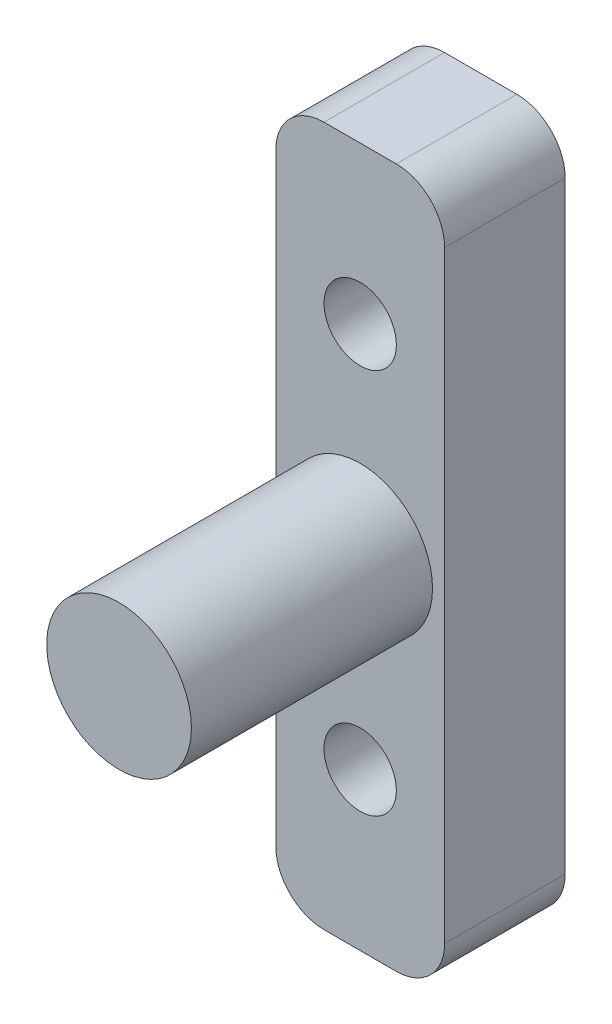
ISO-10303-21;
HEADER;
FILE_DESCRIPTION(('STEP AP214'),'2;1');
FILE_NAME('part.step','',(''),(''),'','','');
FILE_SCHEMA(('AUTOMOTIVE_DESIGN { 1 0 10303 214 1 1 1 1 }'));
ENDSEC;
DATA;
#1=APPLICATION_CONTEXT('core data for automotive mechanical design processes');
#2=APPLICATION_PROTOCOL_DEFINITION('international standard','automotive_design',2000,#1);
#3=PRODUCT_CONTEXT('',#1,'mechanical');
#4=PRODUCT('Part','Part','',(#3));
#5=PRODUCT_RELATED_PRODUCT_CATEGORY('part','',(#4));
#6=PRODUCT_DEFINITION_FORMATION('','',#4);
#7=PRODUCT_DEFINITION_CONTEXT('part definition',#1,'design');
#8=PRODUCT_DEFINITION('design','',#6,#7);
#9=PRODUCT_DEFINITION_SHAPE('','',#8);
#10=(LENGTH_UNIT() NAMED_UNIT(*) SI_UNIT(.MILLI.,.METRE.));
#11=(NAMED_UNIT(*) PLANE_ANGLE_UNIT() SI_UNIT($,.RADIAN.));
#12=(NAMED_UNIT(*) SI_UNIT($,.STERADIAN.) SOLID_ANGLE_UNIT());
#13=UNCERTAINTY_MEASURE_WITH_UNIT(LENGTH_MEASURE(1.E-05),#10,'distance_accuracy_value','');
#14=(GEOMETRIC_REPRESENTATION_CONTEXT(3) GLOBAL_UNCERTAINTY_ASSIGNED_CONTEXT((#13)) GLOBAL_UNIT_ASSIGNED_CONTEXT((#10,
#11,#12)) REPRESENTATION_CONTEXT('',''));
#15=CARTESIAN_POINT('',(0.,0.,0.));
#16=DIRECTION('',(0.,0.,1.));
#17=DIRECTION('',(1.,0.,0.));
#18=AXIS2_PLACEMENT_3D('',#15,#16,#17);
#19=CARTESIAN_POINT('',(5.,12.5,5.));
#20=DIRECTION('',(0.,0.,-1.));
#21=DIRECTION('',(-1.,0.,0.));
#22=AXIS2_PLACEMENT_3D('',#19,#20,#21);
#23=CYLINDRICAL_SURFACE('',#22,2.);
#24=CARTESIAN_POINT('',(5.,12.5,0.));
#25=DIRECTION('',(0.,0.,1.));
#26=DIRECTION('',(1.,0.,0.));
#27=AXIS2_PLACEMENT_3D('',#24,#25,#26);
#28=CIRCLE('',#27,2.);
#29=CARTESIAN_POINT('',(7.,12.5,0.));
#30=VERTEX_POINT('',#29);
#31=CARTESIAN_POINT('',(4.99999999999999,14.5,0.));
#32=VERTEX_POINT('',#31);
#33=EDGE_CURVE('E133',#30,#32,#28,.T.);
#34=ORIENTED_EDGE('',*,*,#33,.T.);
#35=DIRECTION('',(0.,0.,-1.));
#36=VECTOR('',#35,1.);
#37=CARTESIAN_POINT('',(4.99999999999999,14.5,5.));
#38=LINE('',#37,#36);
#39=CARTESIAN_POINT('',(4.99999999999999,14.5,5.));
#40=VERTEX_POINT('',#39);
#41=EDGE_CURVE('E11',#40,#32,#38,.T.);
#42=ORIENTED_EDGE('',*,*,#41,.F.);
#43=CARTESIAN_POINT('',(5.,12.5,5.));
#44=DIRECTION('',(0.,0.,1.));
#45=DIRECTION('',(1.,0.,0.));
#46=AXIS2_PLACEMENT_3D('',#43,#44,#45);
#47=CIRCLE('',#46,2.);
#48=CARTESIAN_POINT('',(7.,12.5,5.));
#49=VERTEX_POINT('',#48);
#50=EDGE_CURVE('E148',#49,#40,#47,.T.);
#51=ORIENTED_EDGE('',*,*,#50,.F.);
#52=DIRECTION('',(0.,0.,-1.));
#53=VECTOR('',#52,1.);
#54=CARTESIAN_POINT('',(7.,12.5,5.));
#55=LINE('',#54,#53);
#56=EDGE_CURVE('E129',#49,#30,#55,.T.);
#57=ORIENTED_EDGE('',*,*,#56,.T.);
#58=EDGE_LOOP('',(#34,#42,#51,#57));
#59=FACE_BOUND('',#58,.T.);
#60=ADVANCED_FACE('F37',(#59),#23,.T.);
#61=CARTESIAN_POINT('',(2.00000000000001,14.5,5.));
#62=DIRECTION('',(0.,-1.,0.));
#63=DIRECTION('',(0.,0.,-1.));
#64=AXIS2_PLACEMENT_3D('',#61,#62,#63);
#65=PLANE('',#64);
#66=DIRECTION('',(-1.,0.,0.));
#67=VECTOR('',#66,1.);
#68=CARTESIAN_POINT('',(2.00000000000001,14.5,0.));
#69=LINE('',#68,#67);
#70=CARTESIAN_POINT('',(2.00000000000001,14.5,0.));
#71=VERTEX_POINT('',#70);
#72=EDGE_CURVE('E136',#32,#71,#69,.T.);
#73=ORIENTED_EDGE('',*,*,#72,.T.);
#74=DIRECTION('',(0.,0.,-1.));
#75=VECTOR('',#74,1.);
#76=CARTESIAN_POINT('',(2.00000000000001,14.5,5.));
#77=LINE('',#76,#75);
#78=CARTESIAN_POINT('',(2.00000000000001,14.5,5.));
#79=VERTEX_POINT('',#78);
#80=EDGE_CURVE('E45',#79,#71,#77,.T.);
#81=ORIENTED_EDGE('',*,*,#80,.F.);
#82=DIRECTION('',(-1.,0.,0.));
#83=VECTOR('',#82,1.);
#84=CARTESIAN_POINT('',(2.00000000000001,14.5,5.));
#85=LINE('',#84,#83);
#86=EDGE_CURVE('E96',#40,#79,#85,.T.);
#87=ORIENTED_EDGE('',*,*,#86,.F.);
#88=ORIENTED_EDGE('',*,*,#41,.T.);
#89=EDGE_LOOP('',(#73,#81,#87,#88));
#90=FACE_BOUND('',#89,.T.);
#91=ADVANCED_FACE('F231',(#90),#65,.F.);
#92=CARTESIAN_POINT('',(2.,12.5,5.));
#93=DIRECTION('',(0.,0.,-1.));
#94=DIRECTION('',(-1.,0.,0.));
#95=AXIS2_PLACEMENT_3D('',#92,#93,#94);
#96=CYLINDRICAL_SURFACE('',#95,2.);
#97=CARTESIAN_POINT('',(2.,12.5,0.));
#98=DIRECTION('',(0.,0.,1.));
#99=DIRECTION('',(-1.,0.,0.));
#100=AXIS2_PLACEMENT_3D('',#97,#98,#99);
#101=CIRCLE('',#100,2.);
#102=CARTESIAN_POINT('',(0.,12.5,0.));
#103=VERTEX_POINT('',#102);
#104=EDGE_CURVE('E139',#71,#103,#101,.T.);
#105=ORIENTED_EDGE('',*,*,#104,.T.);
#106=DIRECTION('',(0.,0.,-1.));
#107=VECTOR('',#106,1.);
#108=CARTESIAN_POINT('',(0.,12.5,5.));
#109=LINE('',#108,#107);
#110=CARTESIAN_POINT('',(0.,12.5,5.));
#111=VERTEX_POINT('',#110);
#112=EDGE_CURVE('E155',#111,#103,#109,.T.);
#113=ORIENTED_EDGE('',*,*,#112,.F.);
#114=CARTESIAN_POINT('',(2.,12.5,5.));
#115=DIRECTION('',(0.,0.,1.));
#116=DIRECTION('',(-1.,0.,0.));
#117=AXIS2_PLACEMENT_3D('',#114,#115,#116);
#118=CIRCLE('',#117,2.);
#119=EDGE_CURVE('E163',#79,#111,#118,.T.);
#120=ORIENTED_EDGE('',*,*,#119,.F.);
#121=ORIENTED_EDGE('',*,*,#80,.T.);
#122=EDGE_LOOP('',(#105,#113,#120,#121));
#123=FACE_BOUND('',#122,.T.);
#124=ADVANCED_FACE('F161',(#123),#96,.T.);
#125=CARTESIAN_POINT('',(0.,-12.5,5.));
#126=DIRECTION('',(1.,0.,0.));
#127=DIRECTION('',(0.,0.,-1.));
#128=AXIS2_PLACEMENT_3D('',#125,#126,#127);
#129=PLANE('',#128);
#130=DIRECTION('',(0.,-1.,0.));
#131=VECTOR('',#130,1.);
#132=CARTESIAN_POINT('',(0.,-12.5,0.));
#133=LINE('',#132,#131);
#134=CARTESIAN_POINT('',(0.,-12.5,0.));
#135=VERTEX_POINT('',#134);
#136=EDGE_CURVE('E141',#103,#135,#133,.T.);
#137=ORIENTED_EDGE('',*,*,#136,.T.);
#138=DIRECTION('',(0.,0.,-1.));
#139=VECTOR('',#138,1.);
#140=CARTESIAN_POINT('',(0.,-12.5,5.));
#141=LINE('',#140,#139);
#142=CARTESIAN_POINT('',(0.,-12.5,5.));
#143=VERTEX_POINT('',#142);
#144=EDGE_CURVE('E152',#143,#135,#141,.T.);
#145=ORIENTED_EDGE('',*,*,#144,.F.);
#146=DIRECTION('',(0.,-1.,0.));
#147=VECTOR('',#146,1.);
#148=CARTESIAN_POINT('',(0.,-12.5,5.));
#149=LINE('',#148,#147);
#150=EDGE_CURVE('E175',#111,#143,#149,.T.);
#151=ORIENTED_EDGE('',*,*,#150,.F.);
#152=ORIENTED_EDGE('',*,*,#112,.T.);
#153=EDGE_LOOP('',(#137,#145,#151,#152));
#154=FACE_BOUND('',#153,.T.);
#155=ADVANCED_FACE('F171',(#154),#129,.F.);
#156=CARTESIAN_POINT('',(2.,-12.5,5.));
#157=DIRECTION('',(0.,0.,-1.));
#158=DIRECTION('',(-1.,0.,0.));
#159=AXIS2_PLACEMENT_3D('',#156,#157,#158);
#160=CYLINDRICAL_SURFACE('',#159,2.);
#161=CARTESIAN_POINT('',(2.,-12.5,0.));
#162=DIRECTION('',(0.,0.,1.));
#163=DIRECTION('',(1.,0.,0.));
#164=AXIS2_PLACEMENT_3D('',#161,#162,#163);
#165=CIRCLE('',#164,2.);
#166=CARTESIAN_POINT('',(2.00000000000001,-14.5,0.));
#167=VERTEX_POINT('',#166);
#168=EDGE_CURVE('E143',#135,#167,#165,.T.);
#169=ORIENTED_EDGE('',*,*,#168,.T.);
#170=DIRECTION('',(0.,0.,-1.));
#171=VECTOR('',#170,1.);
#172=CARTESIAN_POINT('',(2.00000000000001,-14.5,5.));
#173=LINE('',#172,#171);
#174=CARTESIAN_POINT('',(2.00000000000001,-14.5,5.));
#175=VERTEX_POINT('',#174);
#176=EDGE_CURVE('E124',#175,#167,#173,.T.);
#177=ORIENTED_EDGE('',*,*,#176,.F.);
#178=CARTESIAN_POINT('',(2.,-12.5,5.));
#179=DIRECTION('',(0.,0.,1.));
#180=DIRECTION('',(1.,0.,0.));
#181=AXIS2_PLACEMENT_3D('',#178,#179,#180);
#182=CIRCLE('',#181,2.);
#183=EDGE_CURVE('E115',#143,#175,#182,.T.);
#184=ORIENTED_EDGE('',*,*,#183,.F.);
#185=ORIENTED_EDGE('',*,*,#144,.T.);
#186=EDGE_LOOP('',(#169,#177,#184,#185));
#187=FACE_BOUND('',#186,.T.);
#188=ADVANCED_FACE('F174',(#187),#160,.T.);
#189=CARTESIAN_POINT('',(2.00000000000001,-14.5,5.));
#190=DIRECTION('',(0.,1.,0.));
#191=DIRECTION('',(0.,0.,1.));
#192=AXIS2_PLACEMENT_3D('',#189,#190,#191);
#193=PLANE('',#192);
#194=DIRECTION('',(1.,0.,0.));
#195=VECTOR('',#194,1.);
#196=CARTESIAN_POINT('',(2.00000000000001,-14.5,0.));
#197=LINE('',#196,#195);
#198=CARTESIAN_POINT('',(4.99999999999999,-14.5,0.));
#199=VERTEX_POINT('',#198);
#200=EDGE_CURVE('E123',#167,#199,#197,.T.);
#201=ORIENTED_EDGE('',*,*,#200,.T.);
#202=DIRECTION('',(0.,0.,-1.));
#203=VECTOR('',#202,1.);
#204=CARTESIAN_POINT('',(4.99999999999999,-14.5,5.));
#205=LINE('',#204,#203);
#206=CARTESIAN_POINT('',(4.99999999999999,-14.5,5.));
#207=VERTEX_POINT('',#206);
#208=EDGE_CURVE('E120',#207,#199,#205,.T.);
#209=ORIENTED_EDGE('',*,*,#208,.F.);
#210=DIRECTION('',(1.,0.,0.));
#211=VECTOR('',#210,1.);
#212=CARTESIAN_POINT('',(2.00000000000001,-14.5,5.));
#213=LINE('',#212,#211);
#214=EDGE_CURVE('E109',#175,#207,#213,.T.);
#215=ORIENTED_EDGE('',*,*,#214,.F.);
#216=ORIENTED_EDGE('',*,*,#176,.T.);
#217=EDGE_LOOP('',(#201,#209,#215,#216));
#218=FACE_BOUND('',#217,.T.);
#219=ADVANCED_FACE('F121',(#218),#193,.F.);
#220=CARTESIAN_POINT('',(5.,-12.5,5.));
#221=DIRECTION('',(0.,0.,-1.));
#222=DIRECTION('',(-1.,0.,0.));
#223=AXIS2_PLACEMENT_3D('',#220,#221,#222);
#224=CYLINDRICAL_SURFACE('',#223,2.);
#225=CARTESIAN_POINT('',(5.,-12.5,0.));
#226=DIRECTION('',(0.,0.,1.));
#227=DIRECTION('',(-1.,0.,0.));
#228=AXIS2_PLACEMENT_3D('',#225,#226,#227);
#229=CIRCLE('',#228,2.);
#230=CARTESIAN_POINT('',(7.,-12.5,0.));
#231=VERTEX_POINT('',#230);
#232=EDGE_CURVE('E82',#199,#231,#229,.T.);
#233=ORIENTED_EDGE('',*,*,#232,.T.);
#234=DIRECTION('',(0.,0.,-1.));
#235=VECTOR('',#234,1.);
#236=CARTESIAN_POINT('',(7.,-12.5,5.));
#237=LINE('',#236,#235);
#238=CARTESIAN_POINT('',(7.,-12.5,5.));
#239=VERTEX_POINT('',#238);
#240=EDGE_CURVE('E125',#239,#231,#237,.T.);
#241=ORIENTED_EDGE('',*,*,#240,.F.);
#242=CARTESIAN_POINT('',(5.,-12.5,5.));
#243=DIRECTION('',(0.,0.,1.));
#244=DIRECTION('',(-1.,0.,0.));
#245=AXIS2_PLACEMENT_3D('',#242,#243,#244);
#246=CIRCLE('',#245,2.);
#247=EDGE_CURVE('E113',#207,#239,#246,.T.);
#248=ORIENTED_EDGE('',*,*,#247,.F.);
#249=ORIENTED_EDGE('',*,*,#208,.T.);
#250=EDGE_LOOP('',(#233,#241,#248,#249));
#251=FACE_BOUND('',#250,.T.);
#252=ADVANCED_FACE('F127',(#251),#224,.T.);
#253=CARTESIAN_POINT('',(7.,-12.5,5.));
#254=DIRECTION('',(-1.,0.,0.));
#255=DIRECTION('',(0.,0.,1.));
#256=AXIS2_PLACEMENT_3D('',#253,#254,#255);
#257=PLANE('',#256);
#258=DIRECTION('',(0.,1.,0.));
#259=VECTOR('',#258,1.);
#260=CARTESIAN_POINT('',(7.,-12.5,0.));
#261=LINE('',#260,#259);
#262=EDGE_CURVE('E88',#231,#30,#261,.T.);
#263=ORIENTED_EDGE('',*,*,#262,.T.);
#264=ORIENTED_EDGE('',*,*,#56,.F.);
#265=DIRECTION('',(0.,1.,0.));
#266=VECTOR('',#265,1.);
#267=CARTESIAN_POINT('',(7.,-12.5,5.));
#268=LINE('',#267,#266);
#269=EDGE_CURVE('E53',#239,#49,#268,.T.);
#270=ORIENTED_EDGE('',*,*,#269,.F.);
#271=ORIENTED_EDGE('',*,*,#240,.T.);
#272=EDGE_LOOP('',(#263,#264,#270,#271));
#273=FACE_BOUND('',#272,.T.);
#274=ADVANCED_FACE('F210',(#273),#257,.F.);
#275=CARTESIAN_POINT('',(5.,12.5,5.));
#276=DIRECTION('',(0.,0.,1.));
#277=DIRECTION('',(1.,0.,0.));
#278=AXIS2_PLACEMENT_3D('',#275,#276,#277);
#279=PLANE('',#278);
#280=CARTESIAN_POINT('',(3.5,8.,5.));
#281=DIRECTION('',(0.,0.,1.));
#282=DIRECTION('',(1.,0.,0.));
#283=AXIS2_PLACEMENT_3D('',#280,#281,#282);
#284=CIRCLE('',#283,1.5);
#285=CARTESIAN_POINT('',(5.,8.,5.));
#286=VERTEX_POINT('',#285);
#287=EDGE_CURVE('E193',#286,#286,#284,.T.);
#288=ORIENTED_EDGE('',*,*,#287,.F.);
#289=EDGE_LOOP('',(#288));
#290=FACE_BOUND('',#289,.T.);
#291=CARTESIAN_POINT('',(3.5,-8.,5.));
#292=DIRECTION('',(0.,0.,1.));
#293=DIRECTION('',(1.,0.,0.));
#294=AXIS2_PLACEMENT_3D('',#291,#292,#293);
#295=CIRCLE('',#294,1.5);
#296=CARTESIAN_POINT('',(5.,-8.,5.));
#297=VERTEX_POINT('',#296);
#298=EDGE_CURVE('E190',#297,#297,#295,.T.);
#299=ORIENTED_EDGE('',*,*,#298,.F.);
#300=EDGE_LOOP('',(#299));
#301=FACE_BOUND('',#300,.T.);
#302=CARTESIAN_POINT('',(3.5,0.,5.));
#303=DIRECTION('',(0.,0.,1.));
#304=DIRECTION('',(1.,0.,0.));
#305=AXIS2_PLACEMENT_3D('',#302,#303,#304);
#306=CIRCLE('',#305,3.);
#307=CARTESIAN_POINT('',(6.5,0.,5.));
#308=VERTEX_POINT('',#307);
#309=EDGE_CURVE('E181',#308,#308,#306,.T.);
#310=ORIENTED_EDGE('',*,*,#309,.F.);
#311=EDGE_LOOP('',(#310));
#312=FACE_BOUND('',#311,.T.);
#313=ORIENTED_EDGE('',*,*,#50,.T.);
#314=ORIENTED_EDGE('',*,*,#86,.T.);
#315=ORIENTED_EDGE('',*,*,#119,.T.);
#316=ORIENTED_EDGE('',*,*,#150,.T.);
#317=ORIENTED_EDGE('',*,*,#183,.T.);
#318=ORIENTED_EDGE('',*,*,#214,.T.);
#319=ORIENTED_EDGE('',*,*,#247,.T.);
#320=ORIENTED_EDGE('',*,*,#269,.T.);
#321=EDGE_LOOP('',(#313,#314,#315,#316,#317,#318,#319,#320));
#322=FACE_BOUND('',#321,.T.);
#323=ADVANCED_FACE('F111',(#290,#301,#312,#322),#279,.T.);
#324=CARTESIAN_POINT('',(5.,12.5,0.));
#325=DIRECTION('',(0.,0.,1.));
#326=DIRECTION('',(1.,0.,0.));
#327=AXIS2_PLACEMENT_3D('',#324,#325,#326);
#328=PLANE('',#327);
#329=CARTESIAN_POINT('',(3.5,8.,0.));
#330=DIRECTION('',(0.,0.,1.));
#331=DIRECTION('',(1.,0.,0.));
#332=AXIS2_PLACEMENT_3D('',#329,#330,#331);
#333=CIRCLE('',#332,1.5);
#334=CARTESIAN_POINT('',(5.,8.,0.));
#335=VERTEX_POINT('',#334);
#336=EDGE_CURVE('E184',#335,#335,#333,.T.);
#337=ORIENTED_EDGE('',*,*,#336,.T.);
#338=EDGE_LOOP('',(#337));
#339=FACE_BOUND('',#338,.T.);
#340=CARTESIAN_POINT('',(3.5,-8.,0.));
#341=DIRECTION('',(0.,0.,1.));
#342=DIRECTION('',(1.,0.,0.));
#343=AXIS2_PLACEMENT_3D('',#340,#341,#342);
#344=CIRCLE('',#343,1.5);
#345=CARTESIAN_POINT('',(5.,-8.,0.));
#346=VERTEX_POINT('',#345);
#347=EDGE_CURVE('E187',#346,#346,#344,.T.);
#348=ORIENTED_EDGE('',*,*,#347,.T.);
#349=EDGE_LOOP('',(#348));
#350=FACE_BOUND('',#349,.T.);
#351=ORIENTED_EDGE('',*,*,#33,.F.);
#352=ORIENTED_EDGE('',*,*,#262,.F.);
#353=ORIENTED_EDGE('',*,*,#232,.F.);
#354=ORIENTED_EDGE('',*,*,#200,.F.);
#355=ORIENTED_EDGE('',*,*,#168,.F.);
#356=ORIENTED_EDGE('',*,*,#136,.F.);
#357=ORIENTED_EDGE('',*,*,#104,.F.);
#358=ORIENTED_EDGE('',*,*,#72,.F.);
#359=EDGE_LOOP('',(#351,#352,#353,#354,#355,#356,#357,#358));
#360=FACE_BOUND('',#359,.T.);
#361=ADVANCED_FACE('F167',(#339,#350,#360),#328,.F.);
#362=CARTESIAN_POINT('',(3.5,0.,15.));
#363=DIRECTION('',(0.,0.,-1.));
#364=DIRECTION('',(-1.,0.,0.));
#365=AXIS2_PLACEMENT_3D('',#362,#363,#364);
#366=CYLINDRICAL_SURFACE('',#365,3.);
#367=CARTESIAN_POINT('',(3.5,0.,15.));
#368=DIRECTION('',(0.,0.,1.));
#369=DIRECTION('',(1.,0.,0.));
#370=AXIS2_PLACEMENT_3D('',#367,#368,#369);
#371=CIRCLE('',#370,3.);
#372=CARTESIAN_POINT('',(6.5,0.,15.));
#373=VERTEX_POINT('',#372);
#374=EDGE_CURVE('E137',#373,#373,#371,.T.);
#375=ORIENTED_EDGE('',*,*,#374,.F.);
#376=EDGE_LOOP('',(#375));
#377=FACE_BOUND('',#376,.T.);
#378=ORIENTED_EDGE('',*,*,#309,.T.);
#379=EDGE_LOOP('',(#378));
#380=FACE_BOUND('',#379,.T.);
#381=ADVANCED_FACE('F216',(#377,#380),#366,.T.);
#382=CARTESIAN_POINT('',(3.5,0.,15.));
#383=DIRECTION('',(0.,0.,1.));
#384=DIRECTION('',(1.,0.,0.));
#385=AXIS2_PLACEMENT_3D('',#382,#383,#384);
#386=PLANE('',#385);
#387=ORIENTED_EDGE('',*,*,#374,.T.);
#388=EDGE_LOOP('',(#387));
#389=FACE_BOUND('',#388,.T.);
#390=ADVANCED_FACE('F218',(#389),#386,.T.);
#391=CARTESIAN_POINT('',(3.5,-8.,0.));
#392=DIRECTION('',(0.,0.,1.));
#393=DIRECTION('',(1.,0.,0.));
#394=AXIS2_PLACEMENT_3D('',#391,#392,#393);
#395=CYLINDRICAL_SURFACE('',#394,1.5);
#396=ORIENTED_EDGE('',*,*,#347,.F.);
#397=EDGE_LOOP('',(#396));
#398=FACE_BOUND('',#397,.T.);
#399=ORIENTED_EDGE('',*,*,#298,.T.);
#400=EDGE_LOOP('',(#399));
#401=FACE_BOUND('',#400,.T.);
#402=ADVANCED_FACE('F204',(#398,#401),#395,.F.);
#403=CARTESIAN_POINT('',(3.5,8.,0.));
#404=DIRECTION('',(0.,0.,1.));
#405=DIRECTION('',(1.,0.,0.));
#406=AXIS2_PLACEMENT_3D('',#403,#404,#405);
#407=CYLINDRICAL_SURFACE('',#406,1.5);
#408=ORIENTED_EDGE('',*,*,#336,.F.);
#409=EDGE_LOOP('',(#408));
#410=FACE_BOUND('',#409,.T.);
#411=ORIENTED_EDGE('',*,*,#287,.T.);
#412=EDGE_LOOP('',(#411));
#413=FACE_BOUND('',#412,.T.);
#414=ADVANCED_FACE('F201',(#410,#413),#407,.F.);
#415=CLOSED_SHELL('',(#60,#91,#124,#155,#188,#219,#252,#274,#323,#361,#381,#390,#402,#414));
#416=MANIFOLD_SOLID_BREP('B2',#415);
#417=ADVANCED_BREP_SHAPE_REPRESENTATION('',(#18,#416),#14);
#418=SHAPE_DEFINITION_REPRESENTATION(#9,#417);
ENDSEC;
END-ISO-10303-21;
